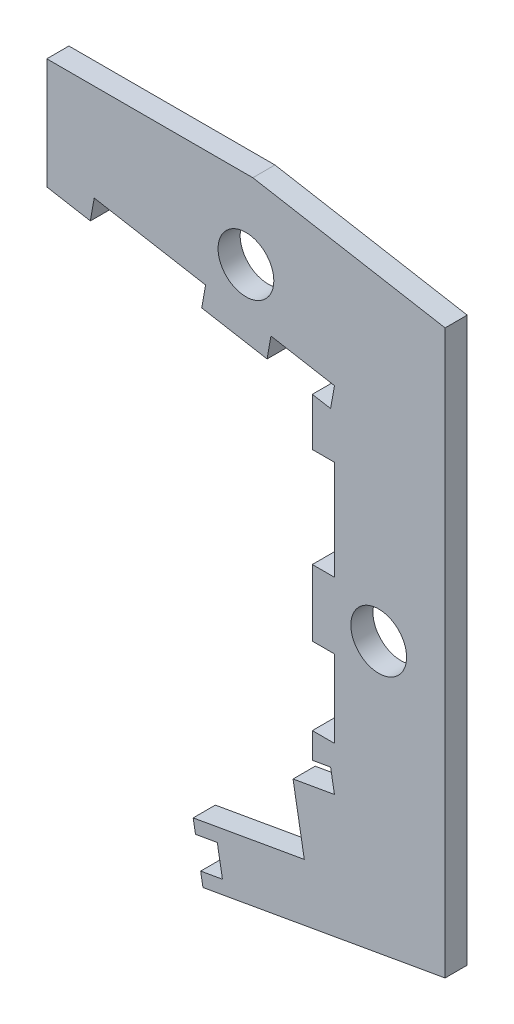
ISO-10303-21;
HEADER;
FILE_DESCRIPTION(('STEP AP214'),'2;1');
FILE_NAME('part.step','',(''),(''),'','','');
FILE_SCHEMA(('AUTOMOTIVE_DESIGN { 1 0 10303 214 1 1 1 1 }'));
ENDSEC;
DATA;
#1=APPLICATION_CONTEXT('core data for automotive mechanical design processes');
#2=APPLICATION_PROTOCOL_DEFINITION('international standard','automotive_design',2000,#1);
#3=PRODUCT_CONTEXT('',#1,'mechanical');
#4=PRODUCT('Part','Part','',(#3));
#5=PRODUCT_RELATED_PRODUCT_CATEGORY('part','',(#4));
#6=PRODUCT_DEFINITION_FORMATION('','',#4);
#7=PRODUCT_DEFINITION_CONTEXT('part definition',#1,'design');
#8=PRODUCT_DEFINITION('design','',#6,#7);
#9=PRODUCT_DEFINITION_SHAPE('','',#8);
#10=(LENGTH_UNIT() NAMED_UNIT(*) SI_UNIT(.MILLI.,.METRE.));
#11=(NAMED_UNIT(*) PLANE_ANGLE_UNIT() SI_UNIT($,.RADIAN.));
#12=(NAMED_UNIT(*) SI_UNIT($,.STERADIAN.) SOLID_ANGLE_UNIT());
#13=UNCERTAINTY_MEASURE_WITH_UNIT(LENGTH_MEASURE(1.E-05),#10,'distance_accuracy_value','');
#14=(GEOMETRIC_REPRESENTATION_CONTEXT(3) GLOBAL_UNCERTAINTY_ASSIGNED_CONTEXT((#13)) GLOBAL_UNIT_ASSIGNED_CONTEXT((#10,
#11,#12)) REPRESENTATION_CONTEXT('',''));
#15=CARTESIAN_POINT('',(0.,0.,0.));
#16=DIRECTION('',(0.,0.,1.));
#17=DIRECTION('',(1.,0.,0.));
#18=AXIS2_PLACEMENT_3D('',#15,#16,#17);
#19=CARTESIAN_POINT('',(-65.,51.4612537460498,5.));
#20=DIRECTION('',(0.173648177666924,0.984807753012209,0.));
#21=DIRECTION('',(-0.984807753012209,0.173648177666924,0.));
#22=AXIS2_PLACEMENT_3D('',#19,#20,#21);
#23=PLANE('',#22);
#24=DIRECTION('',(0.,0.,-1.));
#25=VECTOR('',#24,1.);
#26=CARTESIAN_POINT('',(-54.2836815815433,49.5716776750129,5.));
#27=LINE('',#26,#25);
#28=CARTESIAN_POINT('',(-54.2836815815433,49.5716776750129,5.));
#29=VERTEX_POINT('',#28);
#30=CARTESIAN_POINT('',(-54.2836815815433,49.5716776750129,0.));
#31=VERTEX_POINT('',#30);
#32=EDGE_CURVE('E53',#29,#31,#27,.T.);
#33=ORIENTED_EDGE('',*,*,#32,.T.);
#34=DIRECTION('',(0.984807753012209,-0.173648177666924,0.));
#35=VECTOR('',#34,1.);
#36=CARTESIAN_POINT('',(-65.,51.4612537460498,0.));
#37=LINE('',#36,#35);
#38=CARTESIAN_POINT('',(-29.1225399242608,45.1350895354064,0.));
#39=VERTEX_POINT('',#38);
#40=EDGE_CURVE('E458',#31,#39,#37,.T.);
#41=ORIENTED_EDGE('',*,*,#40,.T.);
#42=DIRECTION('',(0.,0.,-1.));
#43=VECTOR('',#42,1.);
#44=CARTESIAN_POINT('',(-29.1225399242608,45.1350895354064,5.));
#45=LINE('',#44,#43);
#46=CARTESIAN_POINT('',(-29.1225399242608,45.1350895354064,5.));
#47=VERTEX_POINT('',#46);
#48=EDGE_CURVE('E294',#47,#39,#45,.T.);
#49=ORIENTED_EDGE('',*,*,#48,.F.);
#50=DIRECTION('',(0.984807753012209,-0.173648177666924,0.));
#51=VECTOR('',#50,1.);
#52=CARTESIAN_POINT('',(-65.,51.4612537460498,5.));
#53=LINE('',#52,#51);
#54=EDGE_CURVE('E48',#29,#47,#53,.T.);
#55=ORIENTED_EDGE('',*,*,#54,.F.);
#56=EDGE_LOOP('',(#33,#41,#49,#55));
#57=FACE_BOUND('',#56,.T.);
#58=ADVANCED_FACE('F33',(#57),#23,.F.);
#59=DIRECTION('',(0.,0.,-1.));
#60=VECTOR('',#59,1.);
#61=CARTESIAN_POINT('',(-14.3504236290777,42.5303668704026,5.));
#62=LINE('',#61,#60);
#63=CARTESIAN_POINT('',(-14.3504236290777,42.5303668704026,5.));
#64=VERTEX_POINT('',#63);
#65=CARTESIAN_POINT('',(-14.3504236290777,42.5303668704026,0.));
#66=VERTEX_POINT('',#65);
#67=EDGE_CURVE('E303',#64,#66,#62,.T.);
#68=ORIENTED_EDGE('',*,*,#67,.T.);
#69=CARTESIAN_POINT('',(0.,40.,0.));
#70=VERTEX_POINT('',#69);
#71=EDGE_CURVE('E457',#66,#70,#37,.T.);
#72=ORIENTED_EDGE('',*,*,#71,.T.);
#73=DIRECTION('',(0.,0.,-1.));
#74=VECTOR('',#73,1.);
#75=CARTESIAN_POINT('',(0.,40.,5.));
#76=LINE('',#75,#74);
#77=CARTESIAN_POINT('',(0.,40.,5.));
#78=VERTEX_POINT('',#77);
#79=EDGE_CURVE('E11',#78,#70,#76,.T.);
#80=ORIENTED_EDGE('',*,*,#79,.F.);
#81=EDGE_CURVE('E259',#64,#78,#53,.T.);
#82=ORIENTED_EDGE('',*,*,#81,.F.);
#83=EDGE_LOOP('',(#68,#72,#80,#82));
#84=FACE_BOUND('',#83,.T.);
#85=ADVANCED_FACE('F584',(#84),#23,.F.);
#86=CARTESIAN_POINT('',(0.,40.,5.));
#87=DIRECTION('',(1.,0.,0.));
#88=DIRECTION('',(0.,0.,-1.));
#89=AXIS2_PLACEMENT_3D('',#86,#87,#88);
#90=PLANE('',#89);
#91=DIRECTION('',(0.,0.,-1.));
#92=VECTOR('',#91,1.);
#93=CARTESIAN_POINT('',(0.,25.,5.));
#94=LINE('',#93,#92);
#95=CARTESIAN_POINT('',(0.,25.,5.));
#96=VERTEX_POINT('',#95);
#97=CARTESIAN_POINT('',(0.,25.,0.));
#98=VERTEX_POINT('',#97);
#99=EDGE_CURVE('E335',#96,#98,#94,.T.);
#100=ORIENTED_EDGE('',*,*,#99,.T.);
#101=DIRECTION('',(0.,-1.,0.));
#102=VECTOR('',#101,1.);
#103=CARTESIAN_POINT('',(0.,40.,0.));
#104=LINE('',#103,#102);
#105=CARTESIAN_POINT('',(0.,2.49999999999999,0.));
#106=VERTEX_POINT('',#105);
#107=EDGE_CURVE('E461',#98,#106,#104,.T.);
#108=ORIENTED_EDGE('',*,*,#107,.T.);
#109=DIRECTION('',(0.,0.,-1.));
#110=VECTOR('',#109,1.);
#111=CARTESIAN_POINT('',(0.,2.49999999999999,5.));
#112=LINE('',#111,#110);
#113=CARTESIAN_POINT('',(0.,2.49999999999999,5.));
#114=VERTEX_POINT('',#113);
#115=EDGE_CURVE('E366',#114,#106,#112,.T.);
#116=ORIENTED_EDGE('',*,*,#115,.F.);
#117=DIRECTION('',(0.,-1.,0.));
#118=VECTOR('',#117,1.);
#119=CARTESIAN_POINT('',(0.,40.,5.));
#120=LINE('',#119,#118);
#121=EDGE_CURVE('E437',#96,#114,#120,.T.);
#122=ORIENTED_EDGE('',*,*,#121,.F.);
#123=EDGE_LOOP('',(#100,#108,#116,#122));
#124=FACE_BOUND('',#123,.T.);
#125=ADVANCED_FACE('F605',(#124),#90,.F.);
#126=DIRECTION('',(0.,0.,-1.));
#127=VECTOR('',#126,1.);
#128=CARTESIAN_POINT('',(0.,-12.5,5.));
#129=LINE('',#128,#127);
#130=CARTESIAN_POINT('',(0.,-12.5,5.));
#131=VERTEX_POINT('',#130);
#132=CARTESIAN_POINT('',(0.,-12.5,0.));
#133=VERTEX_POINT('',#132);
#134=EDGE_CURVE('E352',#131,#133,#129,.T.);
#135=ORIENTED_EDGE('',*,*,#134,.T.);
#136=CARTESIAN_POINT('',(0.,-30.,0.));
#137=VERTEX_POINT('',#136);
#138=EDGE_CURVE('E460',#133,#137,#104,.T.);
#139=ORIENTED_EDGE('',*,*,#138,.T.);
#140=DIRECTION('',(0.,0.,-1.));
#141=VECTOR('',#140,1.);
#142=CARTESIAN_POINT('',(0.,-30.,5.));
#143=LINE('',#142,#141);
#144=CARTESIAN_POINT('',(0.,-30.,5.));
#145=VERTEX_POINT('',#144);
#146=EDGE_CURVE('E394',#145,#137,#143,.T.);
#147=ORIENTED_EDGE('',*,*,#146,.F.);
#148=EDGE_CURVE('E436',#131,#145,#120,.T.);
#149=ORIENTED_EDGE('',*,*,#148,.F.);
#150=EDGE_LOOP('',(#135,#139,#147,#149));
#151=FACE_BOUND('',#150,.T.);
#152=ADVANCED_FACE('F545',(#151),#90,.F.);
#153=CARTESIAN_POINT('',(-31.9182478663883,-60.539588071327,5.));
#154=DIRECTION('',(0.984807753012207,0.173648177666936,0.));
#155=DIRECTION('',(-0.173648177666936,0.984807753012207,0.));
#156=AXIS2_PLACEMENT_3D('',#153,#154,#155);
#157=PLANE('',#156);
#158=DIRECTION('',(0.173648177666936,-0.984807753012207,0.));
#159=VECTOR('',#158,1.);
#160=CARTESIAN_POINT('',(-31.9182478663883,-60.539588071327,0.));
#161=LINE('',#160,#159);
#162=CARTESIAN_POINT('',(-31.9182478663883,-60.539588071327,0.));
#163=VERTEX_POINT('',#162);
#164=CARTESIAN_POINT('',(-31.3966025064705,-63.4979859173167,0.));
#165=VERTEX_POINT('',#164);
#166=EDGE_CURVE('E470',#163,#165,#161,.T.);
#167=ORIENTED_EDGE('',*,*,#166,.T.);
#168=DIRECTION('',(0.,0.,-1.));
#169=VECTOR('',#168,1.);
#170=CARTESIAN_POINT('',(-31.3966025064705,-63.4979859173167,5.));
#171=LINE('',#170,#169);
#172=CARTESIAN_POINT('',(-31.3966025064705,-63.4979859173167,5.));
#173=VERTEX_POINT('',#172);
#174=EDGE_CURVE('E415',#173,#165,#171,.T.);
#175=ORIENTED_EDGE('',*,*,#174,.F.);
#176=DIRECTION('',(0.173648177666936,-0.984807753012207,0.));
#177=VECTOR('',#176,1.);
#178=CARTESIAN_POINT('',(-31.9182478663883,-60.539588071327,5.));
#179=LINE('',#178,#177);
#180=CARTESIAN_POINT('',(-31.9182478663883,-60.539588071327,5.));
#181=VERTEX_POINT('',#180);
#182=EDGE_CURVE('E446',#181,#173,#179,.T.);
#183=ORIENTED_EDGE('',*,*,#182,.F.);
#184=DIRECTION('',(0.,0.,-1.));
#185=VECTOR('',#184,1.);
#186=CARTESIAN_POINT('',(-31.9182478663883,-60.539588071327,5.));
#187=LINE('',#186,#185);
#188=EDGE_CURVE('E493',#181,#163,#187,.T.);
#189=ORIENTED_EDGE('',*,*,#188,.T.);
#190=EDGE_LOOP('',(#167,#175,#183,#189));
#191=FACE_BOUND('',#190,.T.);
#192=ADVANCED_FACE('F620',(#191),#157,.F.);
#193=CARTESIAN_POINT('',(0.,0.,5.));
#194=DIRECTION('',(0.,0.,-1.));
#195=DIRECTION('',(-1.,0.,0.));
#196=AXIS2_PLACEMENT_3D('',#193,#194,#195);
#197=PLANE('',#196);
#198=ORIENTED_EDGE('',*,*,#182,.T.);
#199=DIRECTION('',(0.984807753012207,0.173648177666935,0.));
#200=VECTOR('',#199,1.);
#201=CARTESIAN_POINT('',(-31.3966025064705,-63.4979859173167,5.));
#202=LINE('',#201,#200);
#203=CARTESIAN_POINT('',(-26.4725637414095,-62.629745028982,5.));
#204=VERTEX_POINT('',#203);
#205=EDGE_CURVE('E398',#173,#204,#202,.T.);
#206=ORIENTED_EDGE('',*,*,#205,.T.);
#207=DIRECTION('',(0.173648177666934,-0.984807753012207,0.));
#208=VECTOR('',#207,1.);
#209=CARTESIAN_POINT('',(-26.4725637414095,-62.629745028982,5.));
#210=LINE('',#209,#208);
#211=CARTESIAN_POINT('',(-25.3069328443356,-69.2403663439415,5.));
#212=VERTEX_POINT('',#211);
#213=EDGE_CURVE('E401',#204,#212,#210,.T.);
#214=ORIENTED_EDGE('',*,*,#213,.T.);
#215=DIRECTION('',(-0.984807753012207,-0.173648177666936,0.));
#216=VECTOR('',#215,1.);
#217=CARTESIAN_POINT('',(-30.2309716093966,-70.1086072322762,5.));
#218=LINE('',#217,#216);
#219=CARTESIAN_POINT('',(-30.2309716093966,-70.1086072322762,5.));
#220=VERTEX_POINT('',#219);
#221=EDGE_CURVE('E405',#212,#220,#218,.T.);
#222=ORIENTED_EDGE('',*,*,#221,.T.);
#223=CARTESIAN_POINT('',(-29.7100270763958,-73.0630304913128,5.));
#224=VERTEX_POINT('',#223);
#225=EDGE_CURVE('E445',#220,#224,#179,.T.);
#226=ORIENTED_EDGE('',*,*,#225,.T.);
#227=DIRECTION('',(0.984807753012209,0.173648177666927,0.));
#228=VECTOR('',#227,1.);
#229=CARTESIAN_POINT('',(-29.7100270763958,-73.0630304913128,5.));
#230=LINE('',#229,#228);
#231=CARTESIAN_POINT('',(25.,-63.4161766024538,5.));
#232=VERTEX_POINT('',#231);
#233=EDGE_CURVE('E448',#224,#232,#230,.T.);
#234=ORIENTED_EDGE('',*,*,#233,.T.);
#235=DIRECTION('',(0.,1.,0.));
#236=VECTOR('',#235,1.);
#237=CARTESIAN_POINT('',(25.,-63.4161766024538,5.));
#238=LINE('',#237,#236);
#239=CARTESIAN_POINT('',(25.,63.8008316848207,5.));
#240=VERTEX_POINT('',#239);
#241=EDGE_CURVE('E450',#232,#240,#238,.T.);
#242=ORIENTED_EDGE('',*,*,#241,.T.);
#243=DIRECTION('',(-0.984807753012209,0.173648177666926,0.));
#244=VECTOR('',#243,1.);
#245=CARTESIAN_POINT('',(25.,63.8008316848207,5.));
#246=LINE('',#245,#244);
#247=CARTESIAN_POINT('',(-18.4444123664485,71.4612537460498,5.));
#248=VERTEX_POINT('',#247);
#249=EDGE_CURVE('E452',#240,#248,#246,.T.);
#250=ORIENTED_EDGE('',*,*,#249,.T.);
#251=DIRECTION('',(-1.,0.,0.));
#252=VECTOR('',#251,1.);
#253=CARTESIAN_POINT('',(-18.4444123664485,71.4612537460498,5.));
#254=LINE('',#253,#252);
#255=CARTESIAN_POINT('',(-65.,71.4612537460498,5.));
#256=VERTEX_POINT('',#255);
#257=EDGE_CURVE('E255',#248,#256,#254,.T.);
#258=ORIENTED_EDGE('',*,*,#257,.T.);
#259=DIRECTION('',(0.,-1.,0.));
#260=VECTOR('',#259,1.);
#261=CARTESIAN_POINT('',(-65.,71.4612537460498,5.));
#262=LINE('',#261,#260);
#263=CARTESIAN_POINT('',(-65.,46.3841206866211,5.));
#264=VERTEX_POINT('',#263);
#265=EDGE_CURVE('E246',#256,#264,#262,.T.);
#266=ORIENTED_EDGE('',*,*,#265,.T.);
#267=DIRECTION('',(0.984807753012209,-0.173648177666924,0.));
#268=VECTOR('',#267,1.);
#269=CARTESIAN_POINT('',(-65.,46.3841206866211,5.));
#270=LINE('',#269,#268);
#271=CARTESIAN_POINT('',(-55.1519224698779,44.6476389099518,5.));
#272=VERTEX_POINT('',#271);
#273=EDGE_CURVE('E252',#264,#272,#270,.T.);
#274=ORIENTED_EDGE('',*,*,#273,.T.);
#275=DIRECTION('',(0.173648177666924,0.984807753012209,0.));
#276=VECTOR('',#275,1.);
#277=CARTESIAN_POINT('',(-55.1519224698779,44.6476389099518,5.));
#278=LINE('',#277,#276);
#279=EDGE_CURVE('E274',#272,#29,#278,.T.);
#280=ORIENTED_EDGE('',*,*,#279,.T.);
#281=ORIENTED_EDGE('',*,*,#54,.T.);
#282=DIRECTION('',(-0.173648177666923,-0.984807753012209,0.));
#283=VECTOR('',#282,1.);
#284=CARTESIAN_POINT('',(-29.9907808125954,40.2110507703454,5.));
#285=LINE('',#284,#283);
#286=CARTESIAN_POINT('',(-29.9907808125954,40.2110507703454,5.));
#287=VERTEX_POINT('',#286);
#288=EDGE_CURVE('E285',#47,#287,#285,.T.);
#289=ORIENTED_EDGE('',*,*,#288,.T.);
#290=DIRECTION('',(0.984807753012209,-0.173648177666924,0.));
#291=VECTOR('',#290,1.);
#292=CARTESIAN_POINT('',(-15.2186645174123,37.6063281053415,5.));
#293=LINE('',#292,#291);
#294=CARTESIAN_POINT('',(-15.2186645174123,37.6063281053415,5.));
#295=VERTEX_POINT('',#294);
#296=EDGE_CURVE('E288',#287,#295,#293,.T.);
#297=ORIENTED_EDGE('',*,*,#296,.T.);
#298=DIRECTION('',(0.173648177666925,0.984807753012209,0.));
#299=VECTOR('',#298,1.);
#300=CARTESIAN_POINT('',(-14.3504236290777,42.5303668704026,5.));
#301=LINE('',#300,#299);
#302=EDGE_CURVE('E291',#295,#64,#301,.T.);
#303=ORIENTED_EDGE('',*,*,#302,.T.);
#304=ORIENTED_EDGE('',*,*,#81,.T.);
#305=DIRECTION('',(-0.173648177666942,-0.984807753012206,0.));
#306=VECTOR('',#305,1.);
#307=CARTESIAN_POINT('',(-0.868240888334718,35.0759612349389,5.));
#308=LINE('',#307,#306);
#309=CARTESIAN_POINT('',(-0.868240888334718,35.0759612349389,5.));
#310=VERTEX_POINT('',#309);
#311=EDGE_CURVE('E322',#78,#310,#308,.T.);
#312=ORIENTED_EDGE('',*,*,#311,.T.);
#313=DIRECTION('',(-0.984807753012206,0.173648177666943,0.));
#314=VECTOR('',#313,1.);
#315=CARTESIAN_POINT('',(-5.00000000000008,35.8045018441136,5.));
#316=LINE('',#315,#314);
#317=CARTESIAN_POINT('',(-5.00000000000008,35.8045018441136,5.));
#318=VERTEX_POINT('',#317);
#319=EDGE_CURVE('E313',#310,#318,#316,.T.);
#320=ORIENTED_EDGE('',*,*,#319,.T.);
#321=DIRECTION('',(0.,-1.,0.));
#322=VECTOR('',#321,1.);
#323=CARTESIAN_POINT('',(-5.00000000000009,25.,5.));
#324=LINE('',#323,#322);
#325=CARTESIAN_POINT('',(-5.00000000000009,25.,5.));
#326=VERTEX_POINT('',#325);
#327=EDGE_CURVE('E316',#318,#326,#324,.T.);
#328=ORIENTED_EDGE('',*,*,#327,.T.);
#329=DIRECTION('',(1.,0.,0.));
#330=VECTOR('',#329,1.);
#331=CARTESIAN_POINT('',(0.,25.,5.));
#332=LINE('',#331,#330);
#333=EDGE_CURVE('E319',#326,#96,#332,.T.);
#334=ORIENTED_EDGE('',*,*,#333,.T.);
#335=ORIENTED_EDGE('',*,*,#121,.T.);
#336=DIRECTION('',(-1.,0.,0.));
#337=VECTOR('',#336,1.);
#338=CARTESIAN_POINT('',(0.,2.49999999999999,5.));
#339=LINE('',#338,#337);
#340=CARTESIAN_POINT('',(-5.00000000000008,2.49999999999999,5.));
#341=VERTEX_POINT('',#340);
#342=EDGE_CURVE('E344',#114,#341,#339,.T.);
#343=ORIENTED_EDGE('',*,*,#342,.T.);
#344=DIRECTION('',(0.,-1.,0.));
#345=VECTOR('',#344,1.);
#346=CARTESIAN_POINT('',(-5.00000000000008,2.49999999999999,5.));
#347=LINE('',#346,#345);
#348=CARTESIAN_POINT('',(-5.00000000000008,-12.5,5.));
#349=VERTEX_POINT('',#348);
#350=EDGE_CURVE('E346',#341,#349,#347,.T.);
#351=ORIENTED_EDGE('',*,*,#350,.T.);
#352=DIRECTION('',(1.,0.,0.));
#353=VECTOR('',#352,1.);
#354=CARTESIAN_POINT('',(0.,-12.5,5.));
#355=LINE('',#354,#353);
#356=EDGE_CURVE('E349',#349,#131,#355,.T.);
#357=ORIENTED_EDGE('',*,*,#356,.T.);
#358=ORIENTED_EDGE('',*,*,#148,.T.);
#359=DIRECTION('',(-1.,0.,0.));
#360=VECTOR('',#359,1.);
#361=CARTESIAN_POINT('',(0.,-30.,5.));
#362=LINE('',#361,#360);
#363=CARTESIAN_POINT('',(-5.00000000000009,-30.,5.));
#364=VERTEX_POINT('',#363);
#365=EDGE_CURVE('E372',#145,#364,#362,.T.);
#366=ORIENTED_EDGE('',*,*,#365,.T.);
#367=DIRECTION('',(0.,-1.,0.));
#368=VECTOR('',#367,1.);
#369=CARTESIAN_POINT('',(-5.00000000000009,-30.,5.));
#370=LINE('',#369,#368);
#371=CARTESIAN_POINT('',(-5.00000000000008,-35.8045018441136,5.));
#372=VERTEX_POINT('',#371);
#373=EDGE_CURVE('E375',#364,#372,#370,.T.);
#374=ORIENTED_EDGE('',*,*,#373,.T.);
#375=DIRECTION('',(0.984807753012206,0.173648177666943,0.));
#376=VECTOR('',#375,1.);
#377=CARTESIAN_POINT('',(-5.00000000000008,-35.8045018441136,5.));
#378=LINE('',#377,#376);
#379=CARTESIAN_POINT('',(-0.868240888334718,-35.0759612349389,5.));
#380=VERTEX_POINT('',#379);
#381=EDGE_CURVE('E377',#372,#380,#378,.T.);
#382=ORIENTED_EDGE('',*,*,#381,.T.);
#383=DIRECTION('',(0.173648177666943,-0.984807753012206,0.));
#384=VECTOR('',#383,1.);
#385=CARTESIAN_POINT('',(-0.868240888334718,-35.0759612349389,5.));
#386=LINE('',#385,#384);
#387=CARTESIAN_POINT('',(0.,-40.,5.));
#388=VERTEX_POINT('',#387);
#389=EDGE_CURVE('E370',#380,#388,#386,.T.);
#390=ORIENTED_EDGE('',*,*,#389,.T.);
#391=DIRECTION('',(-0.984807753012207,-0.173648177666935,0.));
#392=VECTOR('',#391,1.);
#393=CARTESIAN_POINT('',(-9.3591007845964,-41.6502619834942,5.));
#394=LINE('',#393,#392);
#395=CARTESIAN_POINT('',(-9.3591007845964,-41.6502619834942,5.));
#396=VERTEX_POINT('',#395);
#397=EDGE_CURVE('E439',#388,#396,#394,.T.);
#398=ORIENTED_EDGE('',*,*,#397,.T.);
#399=DIRECTION('',(0.173648177666935,-0.984807753012207,0.));
#400=VECTOR('',#399,1.);
#401=CARTESIAN_POINT('',(-6.80907729555746,-56.1121638364784,5.));
#402=LINE('',#401,#400);
#403=CARTESIAN_POINT('',(-6.80907729555746,-56.1121638364784,5.));
#404=VERTEX_POINT('',#403);
#405=EDGE_CURVE('E441',#396,#404,#402,.T.);
#406=ORIENTED_EDGE('',*,*,#405,.T.);
#407=DIRECTION('',(-0.984807753012207,-0.173648177666935,0.));
#408=VECTOR('',#407,1.);
#409=CARTESIAN_POINT('',(-6.80907729555746,-56.1121638364784,5.));
#410=LINE('',#409,#408);
#411=EDGE_CURVE('E443',#404,#181,#410,.T.);
#412=ORIENTED_EDGE('',*,*,#411,.T.);
#413=EDGE_LOOP('',(#198,#206,#214,#222,#226,#234,#242,#250,#258,#266,#274,#280,#281,#289,#297,
#303,#304,#312,#320,#328,#334,#335,#343,#351,#357,#358,#366,#374,#382,#390,#398,#406,#412));
#414=FACE_BOUND('',#413,.T.);
#415=CARTESIAN_POINT('',(-20.,53.6808057330266,5.));
#416=DIRECTION('',(0.,0.,1.));
#417=DIRECTION('',(1.,0.,0.));
#418=AXIS2_PLACEMENT_3D('',#415,#416,#417);
#419=CIRCLE('',#418,6.30000000000009);
#420=CARTESIAN_POINT('',(-13.6999999999999,53.6808057330266,5.));
#421=VERTEX_POINT('',#420);
#422=EDGE_CURVE('E430',#421,#421,#419,.T.);
#423=ORIENTED_EDGE('',*,*,#422,.F.);
#424=EDGE_LOOP('',(#423));
#425=FACE_BOUND('',#424,.T.);
#426=CARTESIAN_POINT('',(9.99999999999995,-5.00000000000001,5.));
#427=DIRECTION('',(0.,0.,1.));
#428=DIRECTION('',(-1.,0.,0.));
#429=AXIS2_PLACEMENT_3D('',#426,#427,#428);
#430=CIRCLE('',#429,6.30000000000009);
#431=CARTESIAN_POINT('',(3.69999999999986,-5.00000000000001,5.));
#432=VERTEX_POINT('',#431);
#433=EDGE_CURVE('E424',#432,#432,#430,.T.);
#434=ORIENTED_EDGE('',*,*,#433,.F.);
#435=EDGE_LOOP('',(#434));
#436=FACE_BOUND('',#435,.T.);
#437=ADVANCED_FACE('F249',(#414,#425,#436),#197,.F.);
#438=CARTESIAN_POINT('',(0.,0.,0.));
#439=DIRECTION('',(0.,0.,-1.));
#440=DIRECTION('',(-1.,0.,0.));
#441=AXIS2_PLACEMENT_3D('',#438,#439,#440);
#442=PLANE('',#441);
#443=DIRECTION('',(0.984807753012207,0.173648177666935,0.));
#444=VECTOR('',#443,1.);
#445=CARTESIAN_POINT('',(-31.3966025064705,-63.4979859173167,0.));
#446=LINE('',#445,#444);
#447=CARTESIAN_POINT('',(-26.4725637414095,-62.629745028982,0.));
#448=VERTEX_POINT('',#447);
#449=EDGE_CURVE('E397',#165,#448,#446,.T.);
#450=ORIENTED_EDGE('',*,*,#449,.F.);
#451=ORIENTED_EDGE('',*,*,#166,.F.);
#452=DIRECTION('',(-0.984807753012207,-0.173648177666935,0.));
#453=VECTOR('',#452,1.);
#454=CARTESIAN_POINT('',(-6.80907729555746,-56.1121638364784,0.));
#455=LINE('',#454,#453);
#456=CARTESIAN_POINT('',(-6.80907729555746,-56.1121638364784,0.));
#457=VERTEX_POINT('',#456);
#458=EDGE_CURVE('E467',#457,#163,#455,.T.);
#459=ORIENTED_EDGE('',*,*,#458,.F.);
#460=DIRECTION('',(0.173648177666935,-0.984807753012207,0.));
#461=VECTOR('',#460,1.);
#462=CARTESIAN_POINT('',(-6.80907729555746,-56.1121638364784,0.));
#463=LINE('',#462,#461);
#464=CARTESIAN_POINT('',(-9.3591007845964,-41.6502619834942,0.));
#465=VERTEX_POINT('',#464);
#466=EDGE_CURVE('E465',#465,#457,#463,.T.);
#467=ORIENTED_EDGE('',*,*,#466,.F.);
#468=DIRECTION('',(-0.984807753012207,-0.173648177666935,0.));
#469=VECTOR('',#468,1.);
#470=CARTESIAN_POINT('',(-9.3591007845964,-41.6502619834942,0.));
#471=LINE('',#470,#469);
#472=CARTESIAN_POINT('',(0.,-40.,0.));
#473=VERTEX_POINT('',#472);
#474=EDGE_CURVE('E463',#473,#465,#471,.T.);
#475=ORIENTED_EDGE('',*,*,#474,.F.);
#476=DIRECTION('',(0.173648177666943,-0.984807753012206,0.));
#477=VECTOR('',#476,1.);
#478=CARTESIAN_POINT('',(-0.868240888334718,-35.0759612349389,0.));
#479=LINE('',#478,#477);
#480=CARTESIAN_POINT('',(-0.868240888334718,-35.0759612349389,0.));
#481=VERTEX_POINT('',#480);
#482=EDGE_CURVE('E369',#481,#473,#479,.T.);
#483=ORIENTED_EDGE('',*,*,#482,.F.);
#484=DIRECTION('',(0.984807753012206,0.173648177666943,0.));
#485=VECTOR('',#484,1.);
#486=CARTESIAN_POINT('',(-5.00000000000008,-35.8045018441136,0.));
#487=LINE('',#486,#485);
#488=CARTESIAN_POINT('',(-5.00000000000008,-35.8045018441136,0.));
#489=VERTEX_POINT('',#488);
#490=EDGE_CURVE('E373',#489,#481,#487,.T.);
#491=ORIENTED_EDGE('',*,*,#490,.F.);
#492=DIRECTION('',(0.,-1.,0.));
#493=VECTOR('',#492,1.);
#494=CARTESIAN_POINT('',(-5.00000000000009,-30.,0.));
#495=LINE('',#494,#493);
#496=CARTESIAN_POINT('',(-5.00000000000009,-30.,0.));
#497=VERTEX_POINT('',#496);
#498=EDGE_CURVE('E383',#497,#489,#495,.T.);
#499=ORIENTED_EDGE('',*,*,#498,.F.);
#500=DIRECTION('',(-1.,0.,0.));
#501=VECTOR('',#500,1.);
#502=CARTESIAN_POINT('',(0.,-30.,0.));
#503=LINE('',#502,#501);
#504=EDGE_CURVE('E381',#137,#497,#503,.T.);
#505=ORIENTED_EDGE('',*,*,#504,.F.);
#506=ORIENTED_EDGE('',*,*,#138,.F.);
#507=DIRECTION('',(1.,0.,0.));
#508=VECTOR('',#507,1.);
#509=CARTESIAN_POINT('',(0.,-12.5,0.));
#510=LINE('',#509,#508);
#511=CARTESIAN_POINT('',(-5.00000000000008,-12.5,0.));
#512=VERTEX_POINT('',#511);
#513=EDGE_CURVE('E347',#512,#133,#510,.T.);
#514=ORIENTED_EDGE('',*,*,#513,.F.);
#515=DIRECTION('',(0.,-1.,0.));
#516=VECTOR('',#515,1.);
#517=CARTESIAN_POINT('',(-5.00000000000008,2.49999999999999,0.));
#518=LINE('',#517,#516);
#519=CARTESIAN_POINT('',(-5.00000000000008,2.49999999999999,0.));
#520=VERTEX_POINT('',#519);
#521=EDGE_CURVE('E354',#520,#512,#518,.T.);
#522=ORIENTED_EDGE('',*,*,#521,.F.);
#523=DIRECTION('',(-1.,0.,0.));
#524=VECTOR('',#523,1.);
#525=CARTESIAN_POINT('',(0.,2.49999999999999,0.));
#526=LINE('',#525,#524);
#527=EDGE_CURVE('E343',#106,#520,#526,.T.);
#528=ORIENTED_EDGE('',*,*,#527,.F.);
#529=ORIENTED_EDGE('',*,*,#107,.F.);
#530=DIRECTION('',(1.,0.,0.));
#531=VECTOR('',#530,1.);
#532=CARTESIAN_POINT('',(0.,25.,0.));
#533=LINE('',#532,#531);
#534=CARTESIAN_POINT('',(-5.00000000000009,25.,0.));
#535=VERTEX_POINT('',#534);
#536=EDGE_CURVE('E329',#535,#98,#533,.T.);
#537=ORIENTED_EDGE('',*,*,#536,.F.);
#538=DIRECTION('',(0.,-1.,0.));
#539=VECTOR('',#538,1.);
#540=CARTESIAN_POINT('',(-5.00000000000009,25.,0.));
#541=LINE('',#540,#539);
#542=CARTESIAN_POINT('',(-5.00000000000008,35.8045018441136,0.));
#543=VERTEX_POINT('',#542);
#544=EDGE_CURVE('E327',#543,#535,#541,.T.);
#545=ORIENTED_EDGE('',*,*,#544,.F.);
#546=DIRECTION('',(-0.984807753012206,0.173648177666943,0.));
#547=VECTOR('',#546,1.);
#548=CARTESIAN_POINT('',(-5.00000000000008,35.8045018441136,0.));
#549=LINE('',#548,#547);
#550=CARTESIAN_POINT('',(-0.868240888334718,35.0759612349389,0.));
#551=VERTEX_POINT('',#550);
#552=EDGE_CURVE('E312',#551,#543,#549,.T.);
#553=ORIENTED_EDGE('',*,*,#552,.F.);
#554=DIRECTION('',(-0.173648177666942,-0.984807753012206,0.));
#555=VECTOR('',#554,1.);
#556=CARTESIAN_POINT('',(-0.868240888334718,35.0759612349389,0.));
#557=LINE('',#556,#555);
#558=EDGE_CURVE('E317',#70,#551,#557,.T.);
#559=ORIENTED_EDGE('',*,*,#558,.F.);
#560=ORIENTED_EDGE('',*,*,#71,.F.);
#561=DIRECTION('',(0.173648177666925,0.984807753012209,0.));
#562=VECTOR('',#561,1.);
#563=CARTESIAN_POINT('',(-14.3504236290777,42.5303668704026,0.));
#564=LINE('',#563,#562);
#565=CARTESIAN_POINT('',(-15.2186645174123,37.6063281053415,0.));
#566=VERTEX_POINT('',#565);
#567=EDGE_CURVE('E289',#566,#66,#564,.T.);
#568=ORIENTED_EDGE('',*,*,#567,.F.);
#569=DIRECTION('',(0.984807753012209,-0.173648177666924,0.));
#570=VECTOR('',#569,1.);
#571=CARTESIAN_POINT('',(-15.2186645174123,37.6063281053415,0.));
#572=LINE('',#571,#570);
#573=CARTESIAN_POINT('',(-29.9907808125954,40.2110507703454,0.));
#574=VERTEX_POINT('',#573);
#575=EDGE_CURVE('E297',#574,#566,#572,.T.);
#576=ORIENTED_EDGE('',*,*,#575,.F.);
#577=DIRECTION('',(-0.173648177666923,-0.984807753012209,0.));
#578=VECTOR('',#577,1.);
#579=CARTESIAN_POINT('',(-29.9907808125954,40.2110507703454,0.));
#580=LINE('',#579,#578);
#581=EDGE_CURVE('E268',#39,#574,#580,.T.);
#582=ORIENTED_EDGE('',*,*,#581,.F.);
#583=ORIENTED_EDGE('',*,*,#40,.F.);
#584=DIRECTION('',(0.173648177666924,0.984807753012209,0.));
#585=VECTOR('',#584,1.);
#586=CARTESIAN_POINT('',(-55.1519224698779,44.6476389099518,0.));
#587=LINE('',#586,#585);
#588=CARTESIAN_POINT('',(-55.1519224698779,44.6476389099518,0.));
#589=VERTEX_POINT('',#588);
#590=EDGE_CURVE('E275',#589,#31,#587,.T.);
#591=ORIENTED_EDGE('',*,*,#590,.F.);
#592=DIRECTION('',(0.984807753012209,-0.173648177666924,0.));
#593=VECTOR('',#592,1.);
#594=CARTESIAN_POINT('',(-65.,46.3841206866211,0.));
#595=LINE('',#594,#593);
#596=CARTESIAN_POINT('',(-65.,46.3841206866211,0.));
#597=VERTEX_POINT('',#596);
#598=EDGE_CURVE('E279',#597,#589,#595,.T.);
#599=ORIENTED_EDGE('',*,*,#598,.F.);
#600=DIRECTION('',(0.,-1.,0.));
#601=VECTOR('',#600,1.);
#602=CARTESIAN_POINT('',(-65.,71.4612537460498,0.));
#603=LINE('',#602,#601);
#604=CARTESIAN_POINT('',(-65.,71.4612537460498,0.));
#605=VERTEX_POINT('',#604);
#606=EDGE_CURVE('E265',#605,#597,#603,.T.);
#607=ORIENTED_EDGE('',*,*,#606,.F.);
#608=DIRECTION('',(-1.,0.,0.));
#609=VECTOR('',#608,1.);
#610=CARTESIAN_POINT('',(-18.4444123664485,71.4612537460498,0.));
#611=LINE('',#610,#609);
#612=CARTESIAN_POINT('',(-18.4444123664485,71.4612537460498,0.));
#613=VERTEX_POINT('',#612);
#614=EDGE_CURVE('E260',#613,#605,#611,.T.);
#615=ORIENTED_EDGE('',*,*,#614,.F.);
#616=DIRECTION('',(-0.984807753012209,0.173648177666926,0.));
#617=VECTOR('',#616,1.);
#618=CARTESIAN_POINT('',(25.,63.8008316848207,0.));
#619=LINE('',#618,#617);
#620=CARTESIAN_POINT('',(25.,63.8008316848207,0.));
#621=VERTEX_POINT('',#620);
#622=EDGE_CURVE('E477',#621,#613,#619,.T.);
#623=ORIENTED_EDGE('',*,*,#622,.F.);
#624=DIRECTION('',(0.,1.,0.));
#625=VECTOR('',#624,1.);
#626=CARTESIAN_POINT('',(25.,-63.4161766024538,0.));
#627=LINE('',#626,#625);
#628=CARTESIAN_POINT('',(25.,-63.4161766024538,0.));
#629=VERTEX_POINT('',#628);
#630=EDGE_CURVE('E475',#629,#621,#627,.T.);
#631=ORIENTED_EDGE('',*,*,#630,.F.);
#632=DIRECTION('',(0.984807753012209,0.173648177666927,0.));
#633=VECTOR('',#632,1.);
#634=CARTESIAN_POINT('',(-29.7100270763958,-73.0630304913128,0.));
#635=LINE('',#634,#633);
#636=CARTESIAN_POINT('',(-29.7100270763958,-73.0630304913128,0.));
#637=VERTEX_POINT('',#636);
#638=EDGE_CURVE('E473',#637,#629,#635,.T.);
#639=ORIENTED_EDGE('',*,*,#638,.F.);
#640=CARTESIAN_POINT('',(-30.2309716093966,-70.1086072322762,0.));
#641=VERTEX_POINT('',#640);
#642=EDGE_CURVE('E469',#641,#637,#161,.T.);
#643=ORIENTED_EDGE('',*,*,#642,.F.);
#644=DIRECTION('',(-0.984807753012207,-0.173648177666936,0.));
#645=VECTOR('',#644,1.);
#646=CARTESIAN_POINT('',(-30.2309716093966,-70.1086072322762,0.));
#647=LINE('',#646,#645);
#648=CARTESIAN_POINT('',(-25.3069328443356,-69.2403663439415,0.));
#649=VERTEX_POINT('',#648);
#650=EDGE_CURVE('E402',#649,#641,#647,.T.);
#651=ORIENTED_EDGE('',*,*,#650,.F.);
#652=DIRECTION('',(0.173648177666934,-0.984807753012207,0.));
#653=VECTOR('',#652,1.);
#654=CARTESIAN_POINT('',(-26.4725637414095,-62.629745028982,0.));
#655=LINE('',#654,#653);
#656=EDGE_CURVE('E411',#448,#649,#655,.T.);
#657=ORIENTED_EDGE('',*,*,#656,.F.);
#658=EDGE_LOOP('',(#450,#451,#459,#467,#475,#483,#491,#499,#505,#506,#514,#522,#528,#529,#537,
#545,#553,#559,#560,#568,#576,#582,#583,#591,#599,#607,#615,#623,#631,#639,#643,#651,#657));
#659=FACE_BOUND('',#658,.T.);
#660=CARTESIAN_POINT('',(-20.,53.6808057330266,0.));
#661=DIRECTION('',(0.,0.,1.));
#662=DIRECTION('',(1.,0.,0.));
#663=AXIS2_PLACEMENT_3D('',#660,#661,#662);
#664=CIRCLE('',#663,6.30000000000009);
#665=CARTESIAN_POINT('',(-13.6999999999999,53.6808057330266,0.));
#666=VERTEX_POINT('',#665);
#667=EDGE_CURVE('E427',#666,#666,#664,.T.);
#668=ORIENTED_EDGE('',*,*,#667,.T.);
#669=EDGE_LOOP('',(#668));
#670=FACE_BOUND('',#669,.T.);
#671=CARTESIAN_POINT('',(9.99999999999995,-5.00000000000001,0.));
#672=DIRECTION('',(0.,0.,1.));
#673=DIRECTION('',(-1.,0.,0.));
#674=AXIS2_PLACEMENT_3D('',#671,#672,#673);
#675=CIRCLE('',#674,6.30000000000009);
#676=CARTESIAN_POINT('',(3.69999999999986,-5.00000000000001,0.));
#677=VERTEX_POINT('',#676);
#678=EDGE_CURVE('E417',#677,#677,#675,.T.);
#679=ORIENTED_EDGE('',*,*,#678,.T.);
#680=EDGE_LOOP('',(#679));
#681=FACE_BOUND('',#680,.T.);
#682=ADVANCED_FACE('F514',(#659,#670,#681),#442,.T.);
#683=CARTESIAN_POINT('',(-65.,71.4612537460498,5.));
#684=DIRECTION('',(1.,0.,0.));
#685=DIRECTION('',(0.,1.,0.));
#686=AXIS2_PLACEMENT_3D('',#683,#684,#685);
#687=PLANE('',#686);
#688=ORIENTED_EDGE('',*,*,#606,.T.);
#689=DIRECTION('',(0.,0.,-1.));
#690=VECTOR('',#689,1.);
#691=CARTESIAN_POINT('',(-65.,46.3841206866211,5.));
#692=LINE('',#691,#690);
#693=EDGE_CURVE('E263',#264,#597,#692,.T.);
#694=ORIENTED_EDGE('',*,*,#693,.F.);
#695=ORIENTED_EDGE('',*,*,#265,.F.);
#696=DIRECTION('',(0.,0.,-1.));
#697=VECTOR('',#696,1.);
#698=CARTESIAN_POINT('',(-65.,71.4612537460498,5.));
#699=LINE('',#698,#697);
#700=EDGE_CURVE('E455',#256,#605,#699,.T.);
#701=ORIENTED_EDGE('',*,*,#700,.T.);
#702=EDGE_LOOP('',(#688,#694,#695,#701));
#703=FACE_BOUND('',#702,.T.);
#704=ADVANCED_FACE('F35',(#703),#687,.F.);
#705=CARTESIAN_POINT('',(-9.3591007845964,-41.6502619834942,5.));
#706=DIRECTION('',(0.173648177666935,-0.984807753012207,0.));
#707=DIRECTION('',(0.984807753012207,0.173648177666935,0.));
#708=AXIS2_PLACEMENT_3D('',#705,#706,#707);
#709=PLANE('',#708);
#710=ORIENTED_EDGE('',*,*,#474,.T.);
#711=DIRECTION('',(0.,0.,-1.));
#712=VECTOR('',#711,1.);
#713=CARTESIAN_POINT('',(-9.3591007845964,-41.6502619834942,5.));
#714=LINE('',#713,#712);
#715=EDGE_CURVE('E499',#396,#465,#714,.T.);
#716=ORIENTED_EDGE('',*,*,#715,.F.);
#717=ORIENTED_EDGE('',*,*,#397,.F.);
#718=DIRECTION('',(0.,0.,-1.));
#719=VECTOR('',#718,1.);
#720=CARTESIAN_POINT('',(0.,-40.,5.));
#721=LINE('',#720,#719);
#722=EDGE_CURVE('E41',#388,#473,#721,.T.);
#723=ORIENTED_EDGE('',*,*,#722,.T.);
#724=EDGE_LOOP('',(#710,#716,#717,#723));
#725=FACE_BOUND('',#724,.T.);
#726=ADVANCED_FACE('F506',(#725),#709,.F.);
#727=CARTESIAN_POINT('',(-6.80907729555746,-56.1121638364784,5.));
#728=DIRECTION('',(0.984807753012207,0.173648177666935,0.));
#729=DIRECTION('',(-0.173648177666935,0.984807753012207,0.));
#730=AXIS2_PLACEMENT_3D('',#727,#728,#729);
#731=PLANE('',#730);
#732=ORIENTED_EDGE('',*,*,#466,.T.);
#733=DIRECTION('',(0.,0.,-1.));
#734=VECTOR('',#733,1.);
#735=CARTESIAN_POINT('',(-6.80907729555746,-56.1121638364784,5.));
#736=LINE('',#735,#734);
#737=EDGE_CURVE('E496',#404,#457,#736,.T.);
#738=ORIENTED_EDGE('',*,*,#737,.F.);
#739=ORIENTED_EDGE('',*,*,#405,.F.);
#740=ORIENTED_EDGE('',*,*,#715,.T.);
#741=EDGE_LOOP('',(#732,#738,#739,#740));
#742=FACE_BOUND('',#741,.T.);
#743=ADVANCED_FACE('F521',(#742),#731,.F.);
#744=CARTESIAN_POINT('',(-6.80907729555746,-56.1121638364784,5.));
#745=DIRECTION('',(0.173648177666935,-0.984807753012207,0.));
#746=DIRECTION('',(0.984807753012207,0.173648177666935,0.));
#747=AXIS2_PLACEMENT_3D('',#744,#745,#746);
#748=PLANE('',#747);
#749=ORIENTED_EDGE('',*,*,#458,.T.);
#750=ORIENTED_EDGE('',*,*,#188,.F.);
#751=ORIENTED_EDGE('',*,*,#411,.F.);
#752=ORIENTED_EDGE('',*,*,#737,.T.);
#753=EDGE_LOOP('',(#749,#750,#751,#752));
#754=FACE_BOUND('',#753,.T.);
#755=ADVANCED_FACE('F525',(#754),#748,.F.);
#756=ORIENTED_EDGE('',*,*,#225,.F.);
#757=DIRECTION('',(0.,0.,-1.));
#758=VECTOR('',#757,1.);
#759=CARTESIAN_POINT('',(-30.2309716093966,-70.1086072322762,5.));
#760=LINE('',#759,#758);
#761=EDGE_CURVE('E418',#220,#641,#760,.T.);
#762=ORIENTED_EDGE('',*,*,#761,.T.);
#763=ORIENTED_EDGE('',*,*,#642,.T.);
#764=DIRECTION('',(0.,0.,-1.));
#765=VECTOR('',#764,1.);
#766=CARTESIAN_POINT('',(-29.7100270763958,-73.0630304913128,5.));
#767=LINE('',#766,#765);
#768=EDGE_CURVE('E490',#224,#637,#767,.T.);
#769=ORIENTED_EDGE('',*,*,#768,.F.);
#770=EDGE_LOOP('',(#756,#762,#763,#769));
#771=FACE_BOUND('',#770,.T.);
#772=ADVANCED_FACE('F615',(#771),#157,.F.);
#773=CARTESIAN_POINT('',(-29.7100270763958,-73.0630304913128,5.));
#774=DIRECTION('',(-0.173648177666927,0.984807753012209,0.));
#775=DIRECTION('',(-0.984807753012209,-0.173648177666927,0.));
#776=AXIS2_PLACEMENT_3D('',#773,#774,#775);
#777=PLANE('',#776);
#778=ORIENTED_EDGE('',*,*,#638,.T.);
#779=DIRECTION('',(0.,0.,-1.));
#780=VECTOR('',#779,1.);
#781=CARTESIAN_POINT('',(25.,-63.4161766024538,5.));
#782=LINE('',#781,#780);
#783=EDGE_CURVE('E487',#232,#629,#782,.T.);
#784=ORIENTED_EDGE('',*,*,#783,.F.);
#785=ORIENTED_EDGE('',*,*,#233,.F.);
#786=ORIENTED_EDGE('',*,*,#768,.T.);
#787=EDGE_LOOP('',(#778,#784,#785,#786));
#788=FACE_BOUND('',#787,.T.);
#789=ADVANCED_FACE('F618',(#788),#777,.F.);
#790=CARTESIAN_POINT('',(25.,-63.4161766024538,5.));
#791=DIRECTION('',(-1.,0.,0.));
#792=DIRECTION('',(0.,-1.,0.));
#793=AXIS2_PLACEMENT_3D('',#790,#791,#792);
#794=PLANE('',#793);
#795=ORIENTED_EDGE('',*,*,#630,.T.);
#796=DIRECTION('',(0.,0.,-1.));
#797=VECTOR('',#796,1.);
#798=CARTESIAN_POINT('',(25.,63.8008316848207,5.));
#799=LINE('',#798,#797);
#800=EDGE_CURVE('E484',#240,#621,#799,.T.);
#801=ORIENTED_EDGE('',*,*,#800,.F.);
#802=ORIENTED_EDGE('',*,*,#241,.F.);
#803=ORIENTED_EDGE('',*,*,#783,.T.);
#804=EDGE_LOOP('',(#795,#801,#802,#803));
#805=FACE_BOUND('',#804,.T.);
#806=ADVANCED_FACE('F623',(#805),#794,.F.);
#807=CARTESIAN_POINT('',(25.,63.8008316848207,5.));
#808=DIRECTION('',(-0.173648177666926,-0.984807753012209,0.));
#809=DIRECTION('',(0.984807753012209,-0.173648177666926,0.));
#810=AXIS2_PLACEMENT_3D('',#807,#808,#809);
#811=PLANE('',#810);
#812=ORIENTED_EDGE('',*,*,#622,.T.);
#813=DIRECTION('',(0.,0.,-1.));
#814=VECTOR('',#813,1.);
#815=CARTESIAN_POINT('',(-18.4444123664485,71.4612537460498,5.));
#816=LINE('',#815,#814);
#817=EDGE_CURVE('E481',#248,#613,#816,.T.);
#818=ORIENTED_EDGE('',*,*,#817,.F.);
#819=ORIENTED_EDGE('',*,*,#249,.F.);
#820=ORIENTED_EDGE('',*,*,#800,.T.);
#821=EDGE_LOOP('',(#812,#818,#819,#820));
#822=FACE_BOUND('',#821,.T.);
#823=ADVANCED_FACE('F627',(#822),#811,.F.);
#824=CARTESIAN_POINT('',(-18.4444123664485,71.4612537460498,5.));
#825=DIRECTION('',(0.,-1.,0.));
#826=DIRECTION('',(1.,0.,0.));
#827=AXIS2_PLACEMENT_3D('',#824,#825,#826);
#828=PLANE('',#827);
#829=ORIENTED_EDGE('',*,*,#614,.T.);
#830=ORIENTED_EDGE('',*,*,#700,.F.);
#831=ORIENTED_EDGE('',*,*,#257,.F.);
#832=ORIENTED_EDGE('',*,*,#817,.T.);
#833=EDGE_LOOP('',(#829,#830,#831,#832));
#834=FACE_BOUND('',#833,.T.);
#835=ADVANCED_FACE('F631',(#834),#828,.F.);
#836=CARTESIAN_POINT('',(-20.,53.6808057330266,5.));
#837=DIRECTION('',(0.,0.,-1.));
#838=DIRECTION('',(-1.,0.,0.));
#839=AXIS2_PLACEMENT_3D('',#836,#837,#838);
#840=CYLINDRICAL_SURFACE('',#839,6.30000000000009);
#841=ORIENTED_EDGE('',*,*,#422,.T.);
#842=EDGE_LOOP('',(#841));
#843=FACE_BOUND('',#842,.T.);
#844=ORIENTED_EDGE('',*,*,#667,.F.);
#845=EDGE_LOOP('',(#844));
#846=FACE_BOUND('',#845,.T.);
#847=ADVANCED_FACE('F635',(#843,#846),#840,.F.);
#848=CARTESIAN_POINT('',(9.99999999999995,-5.00000000000001,5.));
#849=DIRECTION('',(0.,0.,-1.));
#850=DIRECTION('',(-1.,0.,0.));
#851=AXIS2_PLACEMENT_3D('',#848,#849,#850);
#852=CYLINDRICAL_SURFACE('',#851,6.30000000000009);
#853=ORIENTED_EDGE('',*,*,#433,.T.);
#854=EDGE_LOOP('',(#853));
#855=FACE_BOUND('',#854,.T.);
#856=ORIENTED_EDGE('',*,*,#678,.F.);
#857=EDGE_LOOP('',(#856));
#858=FACE_BOUND('',#857,.T.);
#859=ADVANCED_FACE('F643',(#855,#858),#852,.F.);
#860=CARTESIAN_POINT('',(-31.3966025064705,-63.4979859173167,5.));
#861=DIRECTION('',(-0.173648177666935,0.984807753012207,0.));
#862=DIRECTION('',(-0.984807753012207,-0.173648177666935,0.));
#863=AXIS2_PLACEMENT_3D('',#860,#861,#862);
#864=PLANE('',#863);
#865=ORIENTED_EDGE('',*,*,#449,.T.);
#866=DIRECTION('',(0.,0.,-1.));
#867=VECTOR('',#866,1.);
#868=CARTESIAN_POINT('',(-26.4725637414095,-62.629745028982,5.));
#869=LINE('',#868,#867);
#870=EDGE_CURVE('E408',#204,#448,#869,.T.);
#871=ORIENTED_EDGE('',*,*,#870,.F.);
#872=ORIENTED_EDGE('',*,*,#205,.F.);
#873=ORIENTED_EDGE('',*,*,#174,.T.);
#874=EDGE_LOOP('',(#865,#871,#872,#873));
#875=FACE_BOUND('',#874,.T.);
#876=ADVANCED_FACE('F647',(#875),#864,.F.);
#877=CARTESIAN_POINT('',(-30.2309716093966,-70.1086072322762,5.));
#878=DIRECTION('',(0.173648177666936,-0.984807753012207,0.));
#879=DIRECTION('',(0.984807753012207,0.173648177666936,0.));
#880=AXIS2_PLACEMENT_3D('',#877,#878,#879);
#881=PLANE('',#880);
#882=ORIENTED_EDGE('',*,*,#650,.T.);
#883=ORIENTED_EDGE('',*,*,#761,.F.);
#884=ORIENTED_EDGE('',*,*,#221,.F.);
#885=DIRECTION('',(0.,0.,-1.));
#886=VECTOR('',#885,1.);
#887=CARTESIAN_POINT('',(-25.3069328443356,-69.2403663439415,5.));
#888=LINE('',#887,#886);
#889=EDGE_CURVE('E421',#212,#649,#888,.T.);
#890=ORIENTED_EDGE('',*,*,#889,.T.);
#891=EDGE_LOOP('',(#882,#883,#884,#890));
#892=FACE_BOUND('',#891,.T.);
#893=ADVANCED_FACE('F651',(#892),#881,.F.);
#894=CARTESIAN_POINT('',(-26.4725637414095,-62.629745028982,5.));
#895=DIRECTION('',(0.984807753012207,0.173648177666934,0.));
#896=DIRECTION('',(-0.173648177666934,0.984807753012207,0.));
#897=AXIS2_PLACEMENT_3D('',#894,#895,#896);
#898=PLANE('',#897);
#899=ORIENTED_EDGE('',*,*,#656,.T.);
#900=ORIENTED_EDGE('',*,*,#889,.F.);
#901=ORIENTED_EDGE('',*,*,#213,.F.);
#902=ORIENTED_EDGE('',*,*,#870,.T.);
#903=EDGE_LOOP('',(#899,#900,#901,#902));
#904=FACE_BOUND('',#903,.T.);
#905=ADVANCED_FACE('F653',(#904),#898,.F.);
#906=CARTESIAN_POINT('',(-0.868240888334718,-35.0759612349389,5.));
#907=DIRECTION('',(0.984807753012206,0.173648177666943,0.));
#908=DIRECTION('',(-0.173648177666943,0.984807753012206,0.));
#909=AXIS2_PLACEMENT_3D('',#906,#907,#908);
#910=PLANE('',#909);
#911=ORIENTED_EDGE('',*,*,#482,.T.);
#912=ORIENTED_EDGE('',*,*,#722,.F.);
#913=ORIENTED_EDGE('',*,*,#389,.F.);
#914=DIRECTION('',(0.,0.,-1.));
#915=VECTOR('',#914,1.);
#916=CARTESIAN_POINT('',(-0.868240888334718,-35.0759612349389,5.));
#917=LINE('',#916,#915);
#918=EDGE_CURVE('E379',#380,#481,#917,.T.);
#919=ORIENTED_EDGE('',*,*,#918,.T.);
#920=EDGE_LOOP('',(#911,#912,#913,#919));
#921=FACE_BOUND('',#920,.T.);
#922=ADVANCED_FACE('F530',(#921),#910,.F.);
#923=CARTESIAN_POINT('',(0.,-30.,5.));
#924=DIRECTION('',(0.,-1.,0.));
#925=DIRECTION('',(0.,0.,-1.));
#926=AXIS2_PLACEMENT_3D('',#923,#924,#925);
#927=PLANE('',#926);
#928=ORIENTED_EDGE('',*,*,#504,.T.);
#929=DIRECTION('',(0.,0.,-1.));
#930=VECTOR('',#929,1.);
#931=CARTESIAN_POINT('',(-5.00000000000009,-30.,5.));
#932=LINE('',#931,#930);
#933=EDGE_CURVE('E391',#364,#497,#932,.T.);
#934=ORIENTED_EDGE('',*,*,#933,.F.);
#935=ORIENTED_EDGE('',*,*,#365,.F.);
#936=ORIENTED_EDGE('',*,*,#146,.T.);
#937=EDGE_LOOP('',(#928,#934,#935,#936));
#938=FACE_BOUND('',#937,.T.);
#939=ADVANCED_FACE('F542',(#938),#927,.F.);
#940=CARTESIAN_POINT('',(-5.00000000000009,-30.,5.));
#941=DIRECTION('',(1.,0.,0.));
#942=DIRECTION('',(0.,1.,0.));
#943=AXIS2_PLACEMENT_3D('',#940,#941,#942);
#944=PLANE('',#943);
#945=ORIENTED_EDGE('',*,*,#498,.T.);
#946=DIRECTION('',(0.,0.,-1.));
#947=VECTOR('',#946,1.);
#948=CARTESIAN_POINT('',(-5.00000000000008,-35.8045018441136,5.));
#949=LINE('',#948,#947);
#950=EDGE_CURVE('E388',#372,#489,#949,.T.);
#951=ORIENTED_EDGE('',*,*,#950,.F.);
#952=ORIENTED_EDGE('',*,*,#373,.F.);
#953=ORIENTED_EDGE('',*,*,#933,.T.);
#954=EDGE_LOOP('',(#945,#951,#952,#953));
#955=FACE_BOUND('',#954,.T.);
#956=ADVANCED_FACE('F537',(#955),#944,.F.);
#957=CARTESIAN_POINT('',(-5.00000000000008,-35.8045018441136,5.));
#958=DIRECTION('',(-0.173648177666943,0.984807753012206,0.));
#959=DIRECTION('',(-0.984807753012206,-0.173648177666943,0.));
#960=AXIS2_PLACEMENT_3D('',#957,#958,#959);
#961=PLANE('',#960);
#962=ORIENTED_EDGE('',*,*,#490,.T.);
#963=ORIENTED_EDGE('',*,*,#918,.F.);
#964=ORIENTED_EDGE('',*,*,#381,.F.);
#965=ORIENTED_EDGE('',*,*,#950,.T.);
#966=EDGE_LOOP('',(#962,#963,#964,#965));
#967=FACE_BOUND('',#966,.T.);
#968=ADVANCED_FACE('F532',(#967),#961,.F.);
#969=CARTESIAN_POINT('',(0.,2.49999999999999,5.));
#970=DIRECTION('',(0.,-1.,0.));
#971=DIRECTION('',(1.,0.,0.));
#972=AXIS2_PLACEMENT_3D('',#969,#970,#971);
#973=PLANE('',#972);
#974=ORIENTED_EDGE('',*,*,#527,.T.);
#975=DIRECTION('',(0.,0.,-1.));
#976=VECTOR('',#975,1.);
#977=CARTESIAN_POINT('',(-5.00000000000008,2.49999999999999,5.));
#978=LINE('',#977,#976);
#979=EDGE_CURVE('E363',#341,#520,#978,.T.);
#980=ORIENTED_EDGE('',*,*,#979,.F.);
#981=ORIENTED_EDGE('',*,*,#342,.F.);
#982=ORIENTED_EDGE('',*,*,#115,.T.);
#983=EDGE_LOOP('',(#974,#980,#981,#982));
#984=FACE_BOUND('',#983,.T.);
#985=ADVANCED_FACE('F560',(#984),#973,.F.);
#986=CARTESIAN_POINT('',(-5.00000000000008,2.49999999999999,5.));
#987=DIRECTION('',(1.,0.,0.));
#988=DIRECTION('',(0.,1.,0.));
#989=AXIS2_PLACEMENT_3D('',#986,#987,#988);
#990=PLANE('',#989);
#991=ORIENTED_EDGE('',*,*,#521,.T.);
#992=DIRECTION('',(0.,0.,-1.));
#993=VECTOR('',#992,1.);
#994=CARTESIAN_POINT('',(-5.00000000000008,-12.5,5.));
#995=LINE('',#994,#993);
#996=EDGE_CURVE('E360',#349,#512,#995,.T.);
#997=ORIENTED_EDGE('',*,*,#996,.F.);
#998=ORIENTED_EDGE('',*,*,#350,.F.);
#999=ORIENTED_EDGE('',*,*,#979,.T.);
#1000=EDGE_LOOP('',(#991,#997,#998,#999));
#1001=FACE_BOUND('',#1000,.T.);
#1002=ADVANCED_FACE('F556',(#1001),#990,.F.);
#1003=CARTESIAN_POINT('',(0.,-12.5,5.));
#1004=DIRECTION('',(0.,1.,0.));
#1005=DIRECTION('',(0.,0.,1.));
#1006=AXIS2_PLACEMENT_3D('',#1003,#1004,#1005);
#1007=PLANE('',#1006);
#1008=ORIENTED_EDGE('',*,*,#513,.T.);
#1009=ORIENTED_EDGE('',*,*,#134,.F.);
#1010=ORIENTED_EDGE('',*,*,#356,.F.);
#1011=ORIENTED_EDGE('',*,*,#996,.T.);
#1012=EDGE_LOOP('',(#1008,#1009,#1010,#1011));
#1013=FACE_BOUND('',#1012,.T.);
#1014=ADVANCED_FACE('F551',(#1013),#1007,.F.);
#1015=CARTESIAN_POINT('',(-5.00000000000008,35.8045018441136,5.));
#1016=DIRECTION('',(-0.173648177666943,-0.984807753012206,0.));
#1017=DIRECTION('',(0.984807753012206,-0.173648177666943,0.));
#1018=AXIS2_PLACEMENT_3D('',#1015,#1016,#1017);
#1019=PLANE('',#1018);
#1020=ORIENTED_EDGE('',*,*,#552,.T.);
#1021=DIRECTION('',(0.,0.,-1.));
#1022=VECTOR('',#1021,1.);
#1023=CARTESIAN_POINT('',(-5.00000000000008,35.8045018441136,5.));
#1024=LINE('',#1023,#1022);
#1025=EDGE_CURVE('E340',#318,#543,#1024,.T.);
#1026=ORIENTED_EDGE('',*,*,#1025,.F.);
#1027=ORIENTED_EDGE('',*,*,#319,.F.);
#1028=DIRECTION('',(0.,0.,-1.));
#1029=VECTOR('',#1028,1.);
#1030=CARTESIAN_POINT('',(-0.868240888334718,35.0759612349389,5.));
#1031=LINE('',#1030,#1029);
#1032=EDGE_CURVE('E324',#310,#551,#1031,.T.);
#1033=ORIENTED_EDGE('',*,*,#1032,.T.);
#1034=EDGE_LOOP('',(#1020,#1026,#1027,#1033));
#1035=FACE_BOUND('',#1034,.T.);
#1036=ADVANCED_FACE('F576',(#1035),#1019,.F.);
#1037=CARTESIAN_POINT('',(-5.00000000000009,25.,5.));
#1038=DIRECTION('',(1.,0.,0.));
#1039=DIRECTION('',(0.,1.,0.));
#1040=AXIS2_PLACEMENT_3D('',#1037,#1038,#1039);
#1041=PLANE('',#1040);
#1042=ORIENTED_EDGE('',*,*,#544,.T.);
#1043=DIRECTION('',(0.,0.,-1.));
#1044=VECTOR('',#1043,1.);
#1045=CARTESIAN_POINT('',(-5.00000000000009,25.,5.));
#1046=LINE('',#1045,#1044);
#1047=EDGE_CURVE('E337',#326,#535,#1046,.T.);
#1048=ORIENTED_EDGE('',*,*,#1047,.F.);
#1049=ORIENTED_EDGE('',*,*,#327,.F.);
#1050=ORIENTED_EDGE('',*,*,#1025,.T.);
#1051=EDGE_LOOP('',(#1042,#1048,#1049,#1050));
#1052=FACE_BOUND('',#1051,.T.);
#1053=ADVANCED_FACE('F571',(#1052),#1041,.F.);
#1054=CARTESIAN_POINT('',(0.,25.,5.));
#1055=DIRECTION('',(0.,1.,0.));
#1056=DIRECTION('',(0.,0.,1.));
#1057=AXIS2_PLACEMENT_3D('',#1054,#1055,#1056);
#1058=PLANE('',#1057);
#1059=ORIENTED_EDGE('',*,*,#536,.T.);
#1060=ORIENTED_EDGE('',*,*,#99,.F.);
#1061=ORIENTED_EDGE('',*,*,#333,.F.);
#1062=ORIENTED_EDGE('',*,*,#1047,.T.);
#1063=EDGE_LOOP('',(#1059,#1060,#1061,#1062));
#1064=FACE_BOUND('',#1063,.T.);
#1065=ADVANCED_FACE('F567',(#1064),#1058,.F.);
#1066=CARTESIAN_POINT('',(-0.868240888334718,35.0759612349389,5.));
#1067=DIRECTION('',(0.984807753012206,-0.173648177666943,0.));
#1068=DIRECTION('',(0.173648177666943,0.984807753012206,0.));
#1069=AXIS2_PLACEMENT_3D('',#1066,#1067,#1068);
#1070=PLANE('',#1069);
#1071=ORIENTED_EDGE('',*,*,#558,.T.);
#1072=ORIENTED_EDGE('',*,*,#1032,.F.);
#1073=ORIENTED_EDGE('',*,*,#311,.F.);
#1074=ORIENTED_EDGE('',*,*,#79,.T.);
#1075=EDGE_LOOP('',(#1071,#1072,#1073,#1074));
#1076=FACE_BOUND('',#1075,.T.);
#1077=ADVANCED_FACE('F581',(#1076),#1070,.F.);
#1078=CARTESIAN_POINT('',(-29.9907808125954,40.2110507703454,5.));
#1079=DIRECTION('',(0.984807753012209,-0.173648177666923,0.));
#1080=DIRECTION('',(0.173648177666923,0.984807753012209,0.));
#1081=AXIS2_PLACEMENT_3D('',#1078,#1079,#1080);
#1082=PLANE('',#1081);
#1083=ORIENTED_EDGE('',*,*,#581,.T.);
#1084=DIRECTION('',(0.,0.,-1.));
#1085=VECTOR('',#1084,1.);
#1086=CARTESIAN_POINT('',(-29.9907808125954,40.2110507703454,5.));
#1087=LINE('',#1086,#1085);
#1088=EDGE_CURVE('E309',#287,#574,#1087,.T.);
#1089=ORIENTED_EDGE('',*,*,#1088,.F.);
#1090=ORIENTED_EDGE('',*,*,#288,.F.);
#1091=ORIENTED_EDGE('',*,*,#48,.T.);
#1092=EDGE_LOOP('',(#1083,#1089,#1090,#1091));
#1093=FACE_BOUND('',#1092,.T.);
#1094=ADVANCED_FACE('F597',(#1093),#1082,.F.);
#1095=CARTESIAN_POINT('',(-15.2186645174123,37.6063281053415,5.));
#1096=DIRECTION('',(0.173648177666924,0.984807753012209,0.));
#1097=DIRECTION('',(-0.984807753012209,0.173648177666924,0.));
#1098=AXIS2_PLACEMENT_3D('',#1095,#1096,#1097);
#1099=PLANE('',#1098);
#1100=ORIENTED_EDGE('',*,*,#575,.T.);
#1101=DIRECTION('',(0.,0.,-1.));
#1102=VECTOR('',#1101,1.);
#1103=CARTESIAN_POINT('',(-15.2186645174123,37.6063281053415,5.));
#1104=LINE('',#1103,#1102);
#1105=EDGE_CURVE('E306',#295,#566,#1104,.T.);
#1106=ORIENTED_EDGE('',*,*,#1105,.F.);
#1107=ORIENTED_EDGE('',*,*,#296,.F.);
#1108=ORIENTED_EDGE('',*,*,#1088,.T.);
#1109=EDGE_LOOP('',(#1100,#1106,#1107,#1108));
#1110=FACE_BOUND('',#1109,.T.);
#1111=ADVANCED_FACE('F593',(#1110),#1099,.F.);
#1112=CARTESIAN_POINT('',(-14.3504236290777,42.5303668704026,5.));
#1113=DIRECTION('',(-0.984807753012209,0.173648177666925,0.));
#1114=DIRECTION('',(-0.173648177666925,-0.984807753012209,0.));
#1115=AXIS2_PLACEMENT_3D('',#1112,#1113,#1114);
#1116=PLANE('',#1115);
#1117=ORIENTED_EDGE('',*,*,#567,.T.);
#1118=ORIENTED_EDGE('',*,*,#67,.F.);
#1119=ORIENTED_EDGE('',*,*,#302,.F.);
#1120=ORIENTED_EDGE('',*,*,#1105,.T.);
#1121=EDGE_LOOP('',(#1117,#1118,#1119,#1120));
#1122=FACE_BOUND('',#1121,.T.);
#1123=ADVANCED_FACE('F589',(#1122),#1116,.F.);
#1124=CARTESIAN_POINT('',(-65.,46.3841206866211,5.));
#1125=DIRECTION('',(0.173648177666924,0.984807753012209,0.));
#1126=DIRECTION('',(-0.984807753012209,0.173648177666924,0.));
#1127=AXIS2_PLACEMENT_3D('',#1124,#1125,#1126);
#1128=PLANE('',#1127);
#1129=ORIENTED_EDGE('',*,*,#598,.T.);
#1130=DIRECTION('',(0.,0.,-1.));
#1131=VECTOR('',#1130,1.);
#1132=CARTESIAN_POINT('',(-55.1519224698779,44.6476389099518,5.));
#1133=LINE('',#1132,#1131);
#1134=EDGE_CURVE('E269',#272,#589,#1133,.T.);
#1135=ORIENTED_EDGE('',*,*,#1134,.F.);
#1136=ORIENTED_EDGE('',*,*,#273,.F.);
#1137=ORIENTED_EDGE('',*,*,#693,.T.);
#1138=EDGE_LOOP('',(#1129,#1135,#1136,#1137));
#1139=FACE_BOUND('',#1138,.T.);
#1140=ADVANCED_FACE('F271',(#1139),#1128,.F.);
#1141=CARTESIAN_POINT('',(-55.1519224698779,44.6476389099518,5.));
#1142=DIRECTION('',(-0.984807753012209,0.173648177666924,0.));
#1143=DIRECTION('',(-0.173648177666924,-0.984807753012209,0.));
#1144=AXIS2_PLACEMENT_3D('',#1141,#1142,#1143);
#1145=PLANE('',#1144);
#1146=ORIENTED_EDGE('',*,*,#590,.T.);
#1147=ORIENTED_EDGE('',*,*,#32,.F.);
#1148=ORIENTED_EDGE('',*,*,#279,.F.);
#1149=ORIENTED_EDGE('',*,*,#1134,.T.);
#1150=EDGE_LOOP('',(#1146,#1147,#1148,#1149));
#1151=FACE_BOUND('',#1150,.T.);
#1152=ADVANCED_FACE('F600',(#1151),#1145,.F.);
#1153=CLOSED_SHELL('',(#58,#85,#125,#152,#192,#437,#682,#704,#726,#743,#755,#772,#789,#806,#823,
#835,#847,#859,#876,#893,#905,#922,#939,#956,#968,#985,#1002,#1014,#1036,#1053,#1065,#1077,
#1094,#1111,#1123,#1140,#1152));
#1154=MANIFOLD_SOLID_BREP('B2',#1153);
#1155=ADVANCED_BREP_SHAPE_REPRESENTATION('',(#18,#1154),#14);
#1156=SHAPE_DEFINITION_REPRESENTATION(#9,#1155);
ENDSEC;
END-ISO-10303-21;
